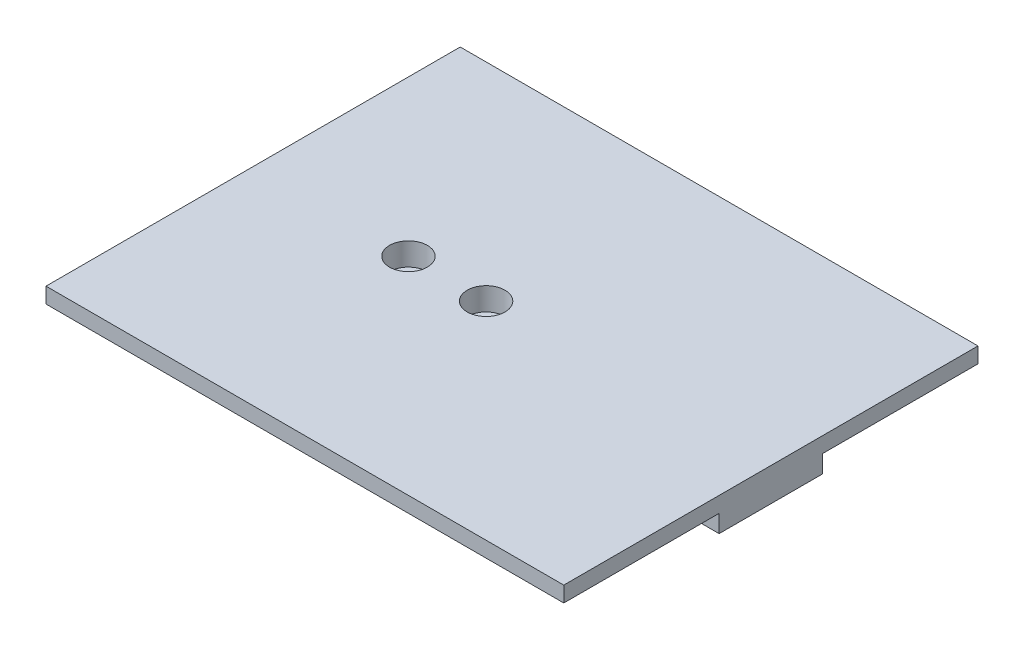
ISO-10303-21;
HEADER;
FILE_DESCRIPTION(('STEP AP214'),'2;1');
FILE_NAME('part.step','',(''),(''),'','','');
FILE_SCHEMA(('AUTOMOTIVE_DESIGN { 1 0 10303 214 1 1 1 1 }'));
ENDSEC;
DATA;
#1=APPLICATION_CONTEXT('core data for automotive mechanical design processes');
#2=APPLICATION_PROTOCOL_DEFINITION('international standard','automotive_design',2000,#1);
#3=PRODUCT_CONTEXT('',#1,'mechanical');
#4=PRODUCT('Part','Part','',(#3));
#5=PRODUCT_RELATED_PRODUCT_CATEGORY('part','',(#4));
#6=PRODUCT_DEFINITION_FORMATION('','',#4);
#7=PRODUCT_DEFINITION_CONTEXT('part definition',#1,'design');
#8=PRODUCT_DEFINITION('design','',#6,#7);
#9=PRODUCT_DEFINITION_SHAPE('','',#8);
#10=(LENGTH_UNIT() NAMED_UNIT(*) SI_UNIT(.MILLI.,.METRE.));
#11=(NAMED_UNIT(*) PLANE_ANGLE_UNIT() SI_UNIT($,.RADIAN.));
#12=(NAMED_UNIT(*) SI_UNIT($,.STERADIAN.) SOLID_ANGLE_UNIT());
#13=UNCERTAINTY_MEASURE_WITH_UNIT(LENGTH_MEASURE(1.E-05),#10,'distance_accuracy_value','');
#14=(GEOMETRIC_REPRESENTATION_CONTEXT(3) GLOBAL_UNCERTAINTY_ASSIGNED_CONTEXT((#13)) GLOBAL_UNIT_ASSIGNED_CONTEXT((#10,
#11,#12)) REPRESENTATION_CONTEXT('',''));
#15=CARTESIAN_POINT('',(0.,0.,0.));
#16=DIRECTION('',(0.,0.,1.));
#17=DIRECTION('',(1.,0.,0.));
#18=AXIS2_PLACEMENT_3D('',#15,#16,#17);
#19=CARTESIAN_POINT('',(0.,0.,0.));
#20=DIRECTION('',(0.,1.,0.));
#21=DIRECTION('',(0.,0.,1.));
#22=AXIS2_PLACEMENT_3D('',#19,#20,#21);
#23=PLANE('',#22);
#24=DIRECTION('',(-1.,0.,0.));
#25=VECTOR('',#24,1.);
#26=CARTESIAN_POINT('',(50.,0.,10.));
#27=LINE('',#26,#25);
#28=CARTESIAN_POINT('',(50.,0.,10.));
#29=VERTEX_POINT('',#28);
#30=CARTESIAN_POINT('',(-50.,0.,10.));
#31=VERTEX_POINT('',#30);
#32=EDGE_CURVE('E49',#29,#31,#27,.T.);
#33=ORIENTED_EDGE('',*,*,#32,.F.);
#34=DIRECTION('',(0.,0.,-1.));
#35=VECTOR('',#34,1.);
#36=CARTESIAN_POINT('',(50.,0.,40.));
#37=LINE('',#36,#35);
#38=CARTESIAN_POINT('',(50.,0.,40.));
#39=VERTEX_POINT('',#38);
#40=EDGE_CURVE('E143',#39,#29,#37,.T.);
#41=ORIENTED_EDGE('',*,*,#40,.F.);
#42=DIRECTION('',(1.,0.,0.));
#43=VECTOR('',#42,1.);
#44=CARTESIAN_POINT('',(50.,0.,40.));
#45=LINE('',#44,#43);
#46=CARTESIAN_POINT('',(-50.,0.,40.));
#47=VERTEX_POINT('',#46);
#48=EDGE_CURVE('E140',#47,#39,#45,.T.);
#49=ORIENTED_EDGE('',*,*,#48,.F.);
#50=DIRECTION('',(0.,0.,1.));
#51=VECTOR('',#50,1.);
#52=CARTESIAN_POINT('',(-50.,0.,40.));
#53=LINE('',#52,#51);
#54=EDGE_CURVE('E54',#31,#47,#53,.T.);
#55=ORIENTED_EDGE('',*,*,#54,.F.);
#56=EDGE_LOOP('',(#33,#41,#49,#55));
#57=FACE_BOUND('',#56,.T.);
#58=ADVANCED_FACE('F34',(#57),#23,.F.);
#59=DIRECTION('',(1.,0.,0.));
#60=VECTOR('',#59,1.);
#61=CARTESIAN_POINT('',(50.,0.,-10.));
#62=LINE('',#61,#60);
#63=CARTESIAN_POINT('',(-50.,0.,-10.));
#64=VERTEX_POINT('',#63);
#65=CARTESIAN_POINT('',(50.,0.,-10.));
#66=VERTEX_POINT('',#65);
#67=EDGE_CURVE('E167',#64,#66,#62,.T.);
#68=ORIENTED_EDGE('',*,*,#67,.F.);
#69=CARTESIAN_POINT('',(-50.,0.,-40.));
#70=VERTEX_POINT('',#69);
#71=EDGE_CURVE('E122',#70,#64,#53,.T.);
#72=ORIENTED_EDGE('',*,*,#71,.F.);
#73=DIRECTION('',(-1.,0.,0.));
#74=VECTOR('',#73,1.);
#75=CARTESIAN_POINT('',(50.,0.,-40.));
#76=LINE('',#75,#74);
#77=CARTESIAN_POINT('',(50.,0.,-40.));
#78=VERTEX_POINT('',#77);
#79=EDGE_CURVE('E133',#78,#70,#76,.T.);
#80=ORIENTED_EDGE('',*,*,#79,.F.);
#81=EDGE_CURVE('E142',#66,#78,#37,.T.);
#82=ORIENTED_EDGE('',*,*,#81,.F.);
#83=EDGE_LOOP('',(#68,#72,#80,#82));
#84=FACE_BOUND('',#83,.T.);
#85=ADVANCED_FACE('F209',(#84),#23,.F.);
#86=CARTESIAN_POINT('',(-50.,3.,40.));
#87=DIRECTION('',(1.,0.,0.));
#88=DIRECTION('',(0.,0.,-1.));
#89=AXIS2_PLACEMENT_3D('',#86,#87,#88);
#90=PLANE('',#89);
#91=ORIENTED_EDGE('',*,*,#71,.T.);
#92=DIRECTION('',(0.,1.,0.));
#93=VECTOR('',#92,1.);
#94=CARTESIAN_POINT('',(-50.,-3.4,-10.));
#95=LINE('',#94,#93);
#96=CARTESIAN_POINT('',(-50.,-3.4,-10.));
#97=VERTEX_POINT('',#96);
#98=EDGE_CURVE('E103',#97,#64,#95,.T.);
#99=ORIENTED_EDGE('',*,*,#98,.F.);
#100=DIRECTION('',(0.,0.,-1.));
#101=VECTOR('',#100,1.);
#102=CARTESIAN_POINT('',(-50.,-3.4,-10.));
#103=LINE('',#102,#101);
#104=CARTESIAN_POINT('',(-50.,-3.4,10.));
#105=VERTEX_POINT('',#104);
#106=EDGE_CURVE('E109',#105,#97,#103,.T.);
#107=ORIENTED_EDGE('',*,*,#106,.F.);
#108=DIRECTION('',(0.,1.,0.));
#109=VECTOR('',#108,1.);
#110=CARTESIAN_POINT('',(-50.,-3.4,10.));
#111=LINE('',#110,#109);
#112=EDGE_CURVE('E161',#105,#31,#111,.T.);
#113=ORIENTED_EDGE('',*,*,#112,.T.);
#114=ORIENTED_EDGE('',*,*,#54,.T.);
#115=DIRECTION('',(0.,-1.,0.));
#116=VECTOR('',#115,1.);
#117=CARTESIAN_POINT('',(-50.,3.,40.));
#118=LINE('',#117,#116);
#119=CARTESIAN_POINT('',(-50.,3.,40.));
#120=VERTEX_POINT('',#119);
#121=EDGE_CURVE('E11',#120,#47,#118,.T.);
#122=ORIENTED_EDGE('',*,*,#121,.F.);
#123=DIRECTION('',(0.,0.,1.));
#124=VECTOR('',#123,1.);
#125=CARTESIAN_POINT('',(-50.,3.,40.));
#126=LINE('',#125,#124);
#127=CARTESIAN_POINT('',(-50.,3.,-40.));
#128=VERTEX_POINT('',#127);
#129=EDGE_CURVE('E129',#128,#120,#126,.T.);
#130=ORIENTED_EDGE('',*,*,#129,.F.);
#131=DIRECTION('',(0.,-1.,0.));
#132=VECTOR('',#131,1.);
#133=CARTESIAN_POINT('',(-50.,3.,-40.));
#134=LINE('',#133,#132);
#135=EDGE_CURVE('E138',#128,#70,#134,.T.);
#136=ORIENTED_EDGE('',*,*,#135,.T.);
#137=EDGE_LOOP('',(#91,#99,#107,#113,#114,#122,#130,#136));
#138=FACE_BOUND('',#137,.T.);
#139=ADVANCED_FACE('F36',(#138),#90,.F.);
#140=CARTESIAN_POINT('',(50.,3.,40.));
#141=DIRECTION('',(0.,0.,-1.));
#142=DIRECTION('',(-1.,0.,0.));
#143=AXIS2_PLACEMENT_3D('',#140,#141,#142);
#144=PLANE('',#143);
#145=ORIENTED_EDGE('',*,*,#48,.T.);
#146=DIRECTION('',(0.,-1.,0.));
#147=VECTOR('',#146,1.);
#148=CARTESIAN_POINT('',(50.,3.,40.));
#149=LINE('',#148,#147);
#150=CARTESIAN_POINT('',(50.,3.,40.));
#151=VERTEX_POINT('',#150);
#152=EDGE_CURVE('E42',#151,#39,#149,.T.);
#153=ORIENTED_EDGE('',*,*,#152,.F.);
#154=DIRECTION('',(1.,0.,0.));
#155=VECTOR('',#154,1.);
#156=CARTESIAN_POINT('',(50.,3.,40.));
#157=LINE('',#156,#155);
#158=EDGE_CURVE('E132',#120,#151,#157,.T.);
#159=ORIENTED_EDGE('',*,*,#158,.F.);
#160=ORIENTED_EDGE('',*,*,#121,.T.);
#161=EDGE_LOOP('',(#145,#153,#159,#160));
#162=FACE_BOUND('',#161,.T.);
#163=ADVANCED_FACE('F159',(#162),#144,.F.);
#164=CARTESIAN_POINT('',(50.,3.,40.));
#165=DIRECTION('',(-1.,0.,0.));
#166=DIRECTION('',(0.,0.,1.));
#167=AXIS2_PLACEMENT_3D('',#164,#165,#166);
#168=PLANE('',#167);
#169=ORIENTED_EDGE('',*,*,#40,.T.);
#170=DIRECTION('',(0.,1.,0.));
#171=VECTOR('',#170,1.);
#172=CARTESIAN_POINT('',(50.,-3.4,10.));
#173=LINE('',#172,#171);
#174=CARTESIAN_POINT('',(50.,-3.4,10.));
#175=VERTEX_POINT('',#174);
#176=EDGE_CURVE('E125',#175,#29,#173,.T.);
#177=ORIENTED_EDGE('',*,*,#176,.F.);
#178=DIRECTION('',(0.,0.,1.));
#179=VECTOR('',#178,1.);
#180=CARTESIAN_POINT('',(50.,-3.4,-10.));
#181=LINE('',#180,#179);
#182=CARTESIAN_POINT('',(50.,-3.4,-10.));
#183=VERTEX_POINT('',#182);
#184=EDGE_CURVE('E108',#183,#175,#181,.T.);
#185=ORIENTED_EDGE('',*,*,#184,.F.);
#186=DIRECTION('',(0.,1.,0.));
#187=VECTOR('',#186,1.);
#188=CARTESIAN_POINT('',(50.,-3.4,-10.));
#189=LINE('',#188,#187);
#190=EDGE_CURVE('E105',#183,#66,#189,.T.);
#191=ORIENTED_EDGE('',*,*,#190,.T.);
#192=ORIENTED_EDGE('',*,*,#81,.T.);
#193=DIRECTION('',(0.,-1.,0.));
#194=VECTOR('',#193,1.);
#195=CARTESIAN_POINT('',(50.,3.,-40.));
#196=LINE('',#195,#194);
#197=CARTESIAN_POINT('',(50.,3.,-40.));
#198=VERTEX_POINT('',#197);
#199=EDGE_CURVE('E147',#198,#78,#196,.T.);
#200=ORIENTED_EDGE('',*,*,#199,.F.);
#201=DIRECTION('',(0.,0.,-1.));
#202=VECTOR('',#201,1.);
#203=CARTESIAN_POINT('',(50.,3.,40.));
#204=LINE('',#203,#202);
#205=EDGE_CURVE('E135',#151,#198,#204,.T.);
#206=ORIENTED_EDGE('',*,*,#205,.F.);
#207=ORIENTED_EDGE('',*,*,#152,.T.);
#208=EDGE_LOOP('',(#169,#177,#185,#191,#192,#200,#206,#207));
#209=FACE_BOUND('',#208,.T.);
#210=ADVANCED_FACE('F153',(#209),#168,.F.);
#211=CARTESIAN_POINT('',(50.,3.,-40.));
#212=DIRECTION('',(0.,0.,1.));
#213=DIRECTION('',(1.,0.,0.));
#214=AXIS2_PLACEMENT_3D('',#211,#212,#213);
#215=PLANE('',#214);
#216=ORIENTED_EDGE('',*,*,#79,.T.);
#217=ORIENTED_EDGE('',*,*,#135,.F.);
#218=DIRECTION('',(-1.,0.,0.));
#219=VECTOR('',#218,1.);
#220=CARTESIAN_POINT('',(50.,3.,-40.));
#221=LINE('',#220,#219);
#222=EDGE_CURVE('E137',#198,#128,#221,.T.);
#223=ORIENTED_EDGE('',*,*,#222,.F.);
#224=ORIENTED_EDGE('',*,*,#199,.T.);
#225=EDGE_LOOP('',(#216,#217,#223,#224));
#226=FACE_BOUND('',#225,.T.);
#227=ADVANCED_FACE('F200',(#226),#215,.F.);
#228=CARTESIAN_POINT('',(0.,3.,0.));
#229=DIRECTION('',(0.,1.,0.));
#230=DIRECTION('',(0.,0.,1.));
#231=AXIS2_PLACEMENT_3D('',#228,#229,#230);
#232=PLANE('',#231);
#233=CARTESIAN_POINT('',(-20.,3.,0.));
#234=DIRECTION('',(0.,1.,0.));
#235=DIRECTION('',(0.,0.,1.));
#236=AXIS2_PLACEMENT_3D('',#233,#234,#235);
#237=CIRCLE('',#236,3.64999999999999);
#238=CARTESIAN_POINT('',(-20.,3.,3.64999999999999));
#239=VERTEX_POINT('',#238);
#240=EDGE_CURVE('E191',#239,#239,#237,.T.);
#241=ORIENTED_EDGE('',*,*,#240,.F.);
#242=EDGE_LOOP('',(#241));
#243=FACE_BOUND('',#242,.T.);
#244=CARTESIAN_POINT('',(-4.99999999999999,3.,0.));
#245=DIRECTION('',(0.,1.,0.));
#246=DIRECTION('',(0.,0.,1.));
#247=AXIS2_PLACEMENT_3D('',#244,#245,#246);
#248=CIRCLE('',#247,3.64999999999999);
#249=CARTESIAN_POINT('',(-4.99999999999999,3.,3.64999999999999));
#250=VERTEX_POINT('',#249);
#251=EDGE_CURVE('E179',#250,#250,#248,.T.);
#252=ORIENTED_EDGE('',*,*,#251,.F.);
#253=EDGE_LOOP('',(#252));
#254=FACE_BOUND('',#253,.T.);
#255=ORIENTED_EDGE('',*,*,#129,.T.);
#256=ORIENTED_EDGE('',*,*,#158,.T.);
#257=ORIENTED_EDGE('',*,*,#205,.T.);
#258=ORIENTED_EDGE('',*,*,#222,.T.);
#259=EDGE_LOOP('',(#255,#256,#257,#258));
#260=FACE_BOUND('',#259,.T.);
#261=ADVANCED_FACE('F197',(#243,#254,#260),#232,.T.);
#262=CARTESIAN_POINT('',(50.,-3.4,-10.));
#263=DIRECTION('',(0.,0.,1.));
#264=DIRECTION('',(1.,0.,0.));
#265=AXIS2_PLACEMENT_3D('',#262,#263,#264);
#266=PLANE('',#265);
#267=ORIENTED_EDGE('',*,*,#67,.T.);
#268=ORIENTED_EDGE('',*,*,#190,.F.);
#269=DIRECTION('',(1.,0.,0.));
#270=VECTOR('',#269,1.);
#271=CARTESIAN_POINT('',(50.,-3.4,-10.));
#272=LINE('',#271,#270);
#273=EDGE_CURVE('E98',#97,#183,#272,.T.);
#274=ORIENTED_EDGE('',*,*,#273,.F.);
#275=ORIENTED_EDGE('',*,*,#98,.T.);
#276=EDGE_LOOP('',(#267,#268,#274,#275));
#277=FACE_BOUND('',#276,.T.);
#278=ADVANCED_FACE('F101',(#277),#266,.F.);
#279=CARTESIAN_POINT('',(50.,-3.4,10.));
#280=DIRECTION('',(0.,0.,-1.));
#281=DIRECTION('',(-1.,0.,0.));
#282=AXIS2_PLACEMENT_3D('',#279,#280,#281);
#283=PLANE('',#282);
#284=ORIENTED_EDGE('',*,*,#32,.T.);
#285=ORIENTED_EDGE('',*,*,#112,.F.);
#286=DIRECTION('',(-1.,0.,0.));
#287=VECTOR('',#286,1.);
#288=CARTESIAN_POINT('',(50.,-3.4,10.));
#289=LINE('',#288,#287);
#290=EDGE_CURVE('E114',#175,#105,#289,.T.);
#291=ORIENTED_EDGE('',*,*,#290,.F.);
#292=ORIENTED_EDGE('',*,*,#176,.T.);
#293=EDGE_LOOP('',(#284,#285,#291,#292));
#294=FACE_BOUND('',#293,.T.);
#295=ADVANCED_FACE('F210',(#294),#283,.F.);
#296=CARTESIAN_POINT('',(0.,-3.4,0.));
#297=DIRECTION('',(0.,-1.,0.));
#298=DIRECTION('',(0.,0.,-1.));
#299=AXIS2_PLACEMENT_3D('',#296,#297,#298);
#300=PLANE('',#299);
#301=CARTESIAN_POINT('',(-20.,-3.4,0.));
#302=DIRECTION('',(0.,1.,0.));
#303=DIRECTION('',(0.,0.,1.));
#304=AXIS2_PLACEMENT_3D('',#301,#302,#303);
#305=CIRCLE('',#304,2.1);
#306=CARTESIAN_POINT('',(-20.,-3.4,2.1));
#307=VERTEX_POINT('',#306);
#308=EDGE_CURVE('E182',#307,#307,#305,.T.);
#309=ORIENTED_EDGE('',*,*,#308,.T.);
#310=EDGE_LOOP('',(#309));
#311=FACE_BOUND('',#310,.T.);
#312=CARTESIAN_POINT('',(-4.99999999999999,-3.4,0.));
#313=DIRECTION('',(0.,1.,0.));
#314=DIRECTION('',(0.,0.,1.));
#315=AXIS2_PLACEMENT_3D('',#312,#313,#314);
#316=CIRCLE('',#315,2.1);
#317=CARTESIAN_POINT('',(-4.99999999999999,-3.4,2.1));
#318=VERTEX_POINT('',#317);
#319=EDGE_CURVE('E168',#318,#318,#316,.T.);
#320=ORIENTED_EDGE('',*,*,#319,.T.);
#321=EDGE_LOOP('',(#320));
#322=FACE_BOUND('',#321,.T.);
#323=ORIENTED_EDGE('',*,*,#106,.T.);
#324=ORIENTED_EDGE('',*,*,#273,.T.);
#325=ORIENTED_EDGE('',*,*,#184,.T.);
#326=ORIENTED_EDGE('',*,*,#290,.T.);
#327=EDGE_LOOP('',(#323,#324,#325,#326));
#328=FACE_BOUND('',#327,.T.);
#329=ADVANCED_FACE('F112',(#311,#322,#328),#300,.T.);
#330=CARTESIAN_POINT('',(-4.99999999999999,3.,0.));
#331=DIRECTION('',(0.,1.,0.));
#332=DIRECTION('',(0.,0.,1.));
#333=AXIS2_PLACEMENT_3D('',#330,#331,#332);
#334=CYLINDRICAL_SURFACE('',#333,2.1);
#335=ORIENTED_EDGE('',*,*,#319,.F.);
#336=EDGE_LOOP('',(#335));
#337=FACE_BOUND('',#336,.T.);
#338=CARTESIAN_POINT('',(-4.99999999999999,-1.4,0.));
#339=DIRECTION('',(0.,1.,0.));
#340=DIRECTION('',(0.,0.,1.));
#341=AXIS2_PLACEMENT_3D('',#338,#339,#340);
#342=CIRCLE('',#341,2.1);
#343=CARTESIAN_POINT('',(-4.99999999999999,-1.4,2.1));
#344=VERTEX_POINT('',#343);
#345=EDGE_CURVE('E173',#344,#344,#342,.T.);
#346=ORIENTED_EDGE('',*,*,#345,.T.);
#347=EDGE_LOOP('',(#346));
#348=FACE_BOUND('',#347,.T.);
#349=ADVANCED_FACE('F217',(#337,#348),#334,.F.);
#350=CARTESIAN_POINT('',(-2.89999999999999,-1.4,0.));
#351=DIRECTION('',(0.,-1.,0.));
#352=DIRECTION('',(0.,0.,-1.));
#353=AXIS2_PLACEMENT_3D('',#350,#351,#352);
#354=PLANE('',#353);
#355=ORIENTED_EDGE('',*,*,#345,.F.);
#356=EDGE_LOOP('',(#355));
#357=FACE_BOUND('',#356,.T.);
#358=CARTESIAN_POINT('',(-4.99999999999999,-1.4,0.));
#359=DIRECTION('',(0.,1.,0.));
#360=DIRECTION('',(0.,0.,1.));
#361=AXIS2_PLACEMENT_3D('',#358,#359,#360);
#362=CIRCLE('',#361,3.65);
#363=CARTESIAN_POINT('',(-4.99999999999999,-1.4,3.65));
#364=VERTEX_POINT('',#363);
#365=EDGE_CURVE('E176',#364,#364,#362,.T.);
#366=ORIENTED_EDGE('',*,*,#365,.T.);
#367=EDGE_LOOP('',(#366));
#368=FACE_BOUND('',#367,.T.);
#369=ADVANCED_FACE('F293',(#357,#368),#354,.F.);
#370=CARTESIAN_POINT('',(-4.99999999999999,3.,0.));
#371=DIRECTION('',(0.,1.,0.));
#372=DIRECTION('',(0.,0.,1.));
#373=AXIS2_PLACEMENT_3D('',#370,#371,#372);
#374=CYLINDRICAL_SURFACE('',#373,3.64999999999999);
#375=ORIENTED_EDGE('',*,*,#365,.F.);
#376=EDGE_LOOP('',(#375));
#377=FACE_BOUND('',#376,.T.);
#378=ORIENTED_EDGE('',*,*,#251,.T.);
#379=EDGE_LOOP('',(#378));
#380=FACE_BOUND('',#379,.T.);
#381=ADVANCED_FACE('F302',(#377,#380),#374,.F.);
#382=CARTESIAN_POINT('',(-20.,3.,0.));
#383=DIRECTION('',(0.,1.,0.));
#384=DIRECTION('',(0.,0.,1.));
#385=AXIS2_PLACEMENT_3D('',#382,#383,#384);
#386=CYLINDRICAL_SURFACE('',#385,2.1);
#387=ORIENTED_EDGE('',*,*,#308,.F.);
#388=EDGE_LOOP('',(#387));
#389=FACE_BOUND('',#388,.T.);
#390=CARTESIAN_POINT('',(-20.,-1.4,0.));
#391=DIRECTION('',(0.,1.,0.));
#392=DIRECTION('',(0.,0.,1.));
#393=AXIS2_PLACEMENT_3D('',#390,#391,#392);
#394=CIRCLE('',#393,2.1);
#395=CARTESIAN_POINT('',(-20.,-1.4,2.1));
#396=VERTEX_POINT('',#395);
#397=EDGE_CURVE('E185',#396,#396,#394,.T.);
#398=ORIENTED_EDGE('',*,*,#397,.T.);
#399=EDGE_LOOP('',(#398));
#400=FACE_BOUND('',#399,.T.);
#401=ADVANCED_FACE('F311',(#389,#400),#386,.F.);
#402=CARTESIAN_POINT('',(-17.9,-1.4,0.));
#403=DIRECTION('',(0.,-1.,0.));
#404=DIRECTION('',(0.,0.,-1.));
#405=AXIS2_PLACEMENT_3D('',#402,#403,#404);
#406=PLANE('',#405);
#407=ORIENTED_EDGE('',*,*,#397,.F.);
#408=EDGE_LOOP('',(#407));
#409=FACE_BOUND('',#408,.T.);
#410=CARTESIAN_POINT('',(-20.,-1.4,0.));
#411=DIRECTION('',(0.,1.,0.));
#412=DIRECTION('',(0.,0.,1.));
#413=AXIS2_PLACEMENT_3D('',#410,#411,#412);
#414=CIRCLE('',#413,3.65);
#415=CARTESIAN_POINT('',(-20.,-1.4,3.65));
#416=VERTEX_POINT('',#415);
#417=EDGE_CURVE('E188',#416,#416,#414,.T.);
#418=ORIENTED_EDGE('',*,*,#417,.T.);
#419=EDGE_LOOP('',(#418));
#420=FACE_BOUND('',#419,.T.);
#421=ADVANCED_FACE('F320',(#409,#420),#406,.F.);
#422=CARTESIAN_POINT('',(-20.,3.,0.));
#423=DIRECTION('',(0.,1.,0.));
#424=DIRECTION('',(0.,0.,1.));
#425=AXIS2_PLACEMENT_3D('',#422,#423,#424);
#426=CYLINDRICAL_SURFACE('',#425,3.65);
#427=ORIENTED_EDGE('',*,*,#417,.F.);
#428=EDGE_LOOP('',(#427));
#429=FACE_BOUND('',#428,.T.);
#430=ORIENTED_EDGE('',*,*,#240,.T.);
#431=EDGE_LOOP('',(#430));
#432=FACE_BOUND('',#431,.T.);
#433=ADVANCED_FACE('F195',(#429,#432),#426,.F.);
#434=CLOSED_SHELL('',(#58,#85,#139,#163,#210,#227,#261,#278,#295,#329,#349,#369,#381,#401,#421,#433));
#435=MANIFOLD_SOLID_BREP('B2',#434);
#436=ADVANCED_BREP_SHAPE_REPRESENTATION('',(#18,#435),#14);
#437=SHAPE_DEFINITION_REPRESENTATION(#9,#436);
ENDSEC;
END-ISO-10303-21;
